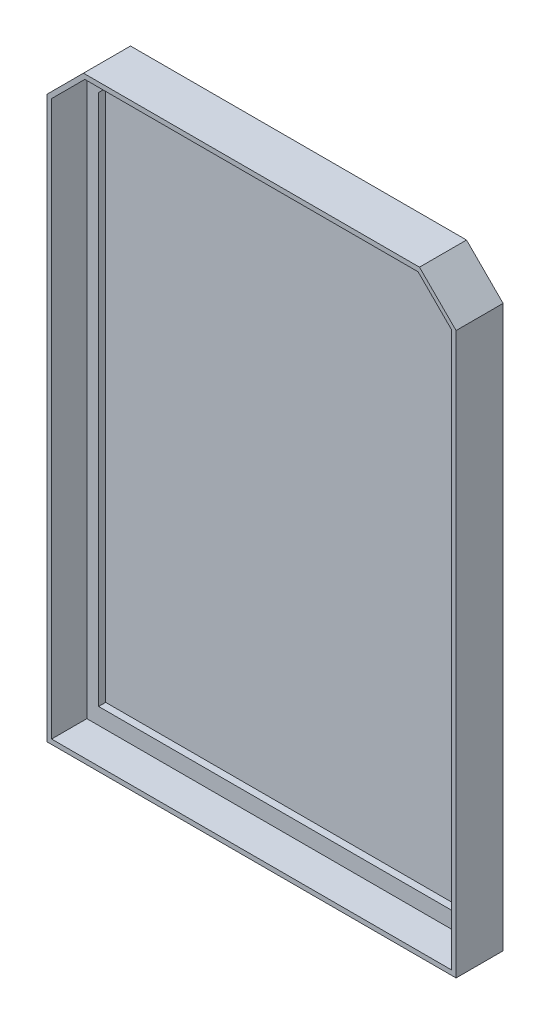
ISO-10303-21;
HEADER;
FILE_DESCRIPTION(('STEP AP214'),'2;1');
FILE_NAME('part.step','',(''),(''),'','','');
FILE_SCHEMA(('AUTOMOTIVE_DESIGN { 1 0 10303 214 1 1 1 1 }'));
ENDSEC;
DATA;
#1=APPLICATION_CONTEXT('core data for automotive mechanical design processes');
#2=APPLICATION_PROTOCOL_DEFINITION('international standard','automotive_design',2000,#1);
#3=PRODUCT_CONTEXT('',#1,'mechanical');
#4=PRODUCT('Part','Part','',(#3));
#5=PRODUCT_RELATED_PRODUCT_CATEGORY('part','',(#4));
#6=PRODUCT_DEFINITION_FORMATION('','',#4);
#7=PRODUCT_DEFINITION_CONTEXT('part definition',#1,'design');
#8=PRODUCT_DEFINITION('design','',#6,#7);
#9=PRODUCT_DEFINITION_SHAPE('','',#8);
#10=(LENGTH_UNIT() NAMED_UNIT(*) SI_UNIT(.MILLI.,.METRE.));
#11=(NAMED_UNIT(*) PLANE_ANGLE_UNIT() SI_UNIT($,.RADIAN.));
#12=(NAMED_UNIT(*) SI_UNIT($,.STERADIAN.) SOLID_ANGLE_UNIT());
#13=UNCERTAINTY_MEASURE_WITH_UNIT(LENGTH_MEASURE(1.E-05),#10,'distance_accuracy_value','');
#14=(GEOMETRIC_REPRESENTATION_CONTEXT(3) GLOBAL_UNCERTAINTY_ASSIGNED_CONTEXT((#13)) GLOBAL_UNIT_ASSIGNED_CONTEXT((#10,
#11,#12)) REPRESENTATION_CONTEXT('',''));
#15=CARTESIAN_POINT('',(0.,0.,0.));
#16=DIRECTION('',(0.,0.,1.));
#17=DIRECTION('',(1.,0.,0.));
#18=AXIS2_PLACEMENT_3D('',#15,#16,#17);
#19=CARTESIAN_POINT('',(47.0251262658472,47.0251262658468,1.5));
#20=DIRECTION('',(0.70710678118655,0.707106781186544,0.));
#21=DIRECTION('',(-0.707106781186545,0.707106781186551,0.));
#22=AXIS2_PLACEMENT_3D('',#19,#20,#21);
#23=PLANE('',#22);
#24=DIRECTION('',(0.707106781186545,-0.707106781186551,0.));
#25=VECTOR('',#24,1.);
#26=CARTESIAN_POINT('',(47.0251262658472,47.0251262658468,0.));
#27=LINE('',#26,#25);
#28=CARTESIAN_POINT('',(35.0502525316942,59.,0.));
#29=VERTEX_POINT('',#28);
#30=CARTESIAN_POINT('',(40.,54.0502525316941,0.));
#31=VERTEX_POINT('',#30);
#32=EDGE_CURVE('E171',#29,#31,#27,.T.);
#33=ORIENTED_EDGE('',*,*,#32,.T.);
#34=DIRECTION('',(0.,0.,-1.));
#35=VECTOR('',#34,1.);
#36=CARTESIAN_POINT('',(40.,54.0502525316941,1.5));
#37=LINE('',#36,#35);
#38=CARTESIAN_POINT('',(40.,54.0502525316941,1.5));
#39=VERTEX_POINT('',#38);
#40=EDGE_CURVE('E318',#39,#31,#37,.T.);
#41=ORIENTED_EDGE('',*,*,#40,.F.);
#42=DIRECTION('',(0.707106781186545,-0.707106781186551,0.));
#43=VECTOR('',#42,1.);
#44=CARTESIAN_POINT('',(47.0251262658472,47.0251262658468,1.5));
#45=LINE('',#44,#43);
#46=CARTESIAN_POINT('',(35.0502525316942,59.,1.5));
#47=VERTEX_POINT('',#46);
#48=EDGE_CURVE('E259',#47,#39,#45,.T.);
#49=ORIENTED_EDGE('',*,*,#48,.F.);
#50=DIRECTION('',(0.,0.,-1.));
#51=VECTOR('',#50,1.);
#52=CARTESIAN_POINT('',(35.0502525316942,59.,1.5));
#53=LINE('',#52,#51);
#54=EDGE_CURVE('E288',#47,#29,#53,.T.);
#55=ORIENTED_EDGE('',*,*,#54,.T.);
#56=EDGE_LOOP('',(#33,#41,#49,#55));
#57=FACE_BOUND('',#56,.T.);
#58=ADVANCED_FACE('F41',(#57),#23,.F.);
#59=CARTESIAN_POINT('',(40.,0.,1.5));
#60=DIRECTION('',(1.,0.,0.));
#61=DIRECTION('',(0.,0.,-1.));
#62=AXIS2_PLACEMENT_3D('',#59,#60,#61);
#63=PLANE('',#62);
#64=DIRECTION('',(0.,-1.,0.));
#65=VECTOR('',#64,1.);
#66=CARTESIAN_POINT('',(40.,0.,0.));
#67=LINE('',#66,#65);
#68=CARTESIAN_POINT('',(40.,-59.,0.));
#69=VERTEX_POINT('',#68);
#70=EDGE_CURVE('E291',#31,#69,#67,.T.);
#71=ORIENTED_EDGE('',*,*,#70,.T.);
#72=DIRECTION('',(0.,0.,-1.));
#73=VECTOR('',#72,1.);
#74=CARTESIAN_POINT('',(40.,-59.,1.5));
#75=LINE('',#74,#73);
#76=CARTESIAN_POINT('',(40.,-59.,1.5));
#77=VERTEX_POINT('',#76);
#78=EDGE_CURVE('E315',#77,#69,#75,.T.);
#79=ORIENTED_EDGE('',*,*,#78,.F.);
#80=DIRECTION('',(0.,-1.,0.));
#81=VECTOR('',#80,1.);
#82=CARTESIAN_POINT('',(40.,0.,1.5));
#83=LINE('',#82,#81);
#84=EDGE_CURVE('E262',#39,#77,#83,.T.);
#85=ORIENTED_EDGE('',*,*,#84,.F.);
#86=ORIENTED_EDGE('',*,*,#40,.T.);
#87=EDGE_LOOP('',(#71,#79,#85,#86));
#88=FACE_BOUND('',#87,.T.);
#89=ADVANCED_FACE('F338',(#88),#63,.F.);
#90=CARTESIAN_POINT('',(0.,-59.,1.5));
#91=DIRECTION('',(0.,-1.,0.));
#92=DIRECTION('',(0.,0.,-1.));
#93=AXIS2_PLACEMENT_3D('',#90,#91,#92);
#94=PLANE('',#93);
#95=DIRECTION('',(-1.,0.,0.));
#96=VECTOR('',#95,1.);
#97=CARTESIAN_POINT('',(0.,-59.,0.));
#98=LINE('',#97,#96);
#99=CARTESIAN_POINT('',(-40.,-59.,0.));
#100=VERTEX_POINT('',#99);
#101=EDGE_CURVE('E294',#69,#100,#98,.T.);
#102=ORIENTED_EDGE('',*,*,#101,.T.);
#103=DIRECTION('',(0.,0.,-1.));
#104=VECTOR('',#103,1.);
#105=CARTESIAN_POINT('',(-40.,-59.,1.5));
#106=LINE('',#105,#104);
#107=CARTESIAN_POINT('',(-40.,-59.,1.5));
#108=VERTEX_POINT('',#107);
#109=EDGE_CURVE('E312',#108,#100,#106,.T.);
#110=ORIENTED_EDGE('',*,*,#109,.F.);
#111=DIRECTION('',(-1.,0.,0.));
#112=VECTOR('',#111,1.);
#113=CARTESIAN_POINT('',(0.,-59.,1.5));
#114=LINE('',#113,#112);
#115=EDGE_CURVE('E265',#77,#108,#114,.T.);
#116=ORIENTED_EDGE('',*,*,#115,.F.);
#117=ORIENTED_EDGE('',*,*,#78,.T.);
#118=EDGE_LOOP('',(#102,#110,#116,#117));
#119=FACE_BOUND('',#118,.T.);
#120=ADVANCED_FACE('F344',(#119),#94,.F.);
#121=CARTESIAN_POINT('',(-40.,0.,1.5));
#122=DIRECTION('',(-1.,0.,0.));
#123=DIRECTION('',(0.,0.,1.));
#124=AXIS2_PLACEMENT_3D('',#121,#122,#123);
#125=PLANE('',#124);
#126=DIRECTION('',(0.,1.,0.));
#127=VECTOR('',#126,1.);
#128=CARTESIAN_POINT('',(-40.,0.,0.));
#129=LINE('',#128,#127);
#130=CARTESIAN_POINT('',(-40.,54.0502525316942,0.));
#131=VERTEX_POINT('',#130);
#132=EDGE_CURVE('E297',#100,#131,#129,.T.);
#133=ORIENTED_EDGE('',*,*,#132,.T.);
#134=DIRECTION('',(0.,0.,-1.));
#135=VECTOR('',#134,1.);
#136=CARTESIAN_POINT('',(-40.,54.0502525316942,1.5));
#137=LINE('',#136,#135);
#138=CARTESIAN_POINT('',(-40.,54.0502525316942,1.5));
#139=VERTEX_POINT('',#138);
#140=EDGE_CURVE('E309',#139,#131,#137,.T.);
#141=ORIENTED_EDGE('',*,*,#140,.F.);
#142=DIRECTION('',(0.,1.,0.));
#143=VECTOR('',#142,1.);
#144=CARTESIAN_POINT('',(-40.,0.,1.5));
#145=LINE('',#144,#143);
#146=EDGE_CURVE('E267',#108,#139,#145,.T.);
#147=ORIENTED_EDGE('',*,*,#146,.F.);
#148=ORIENTED_EDGE('',*,*,#109,.T.);
#149=EDGE_LOOP('',(#133,#141,#147,#148));
#150=FACE_BOUND('',#149,.T.);
#151=ADVANCED_FACE('F350',(#150),#125,.F.);
#152=CARTESIAN_POINT('',(-47.025126265847,47.0251262658472,1.5));
#153=DIRECTION('',(-0.707106781186545,0.707106781186549,0.));
#154=DIRECTION('',(-0.70710678118655,-0.707106781186546,0.));
#155=AXIS2_PLACEMENT_3D('',#152,#153,#154);
#156=PLANE('',#155);
#157=DIRECTION('',(0.70710678118655,0.707106781186546,0.));
#158=VECTOR('',#157,1.);
#159=CARTESIAN_POINT('',(-47.025126265847,47.0251262658472,0.));
#160=LINE('',#159,#158);
#161=CARTESIAN_POINT('',(-35.0502525316941,59.,0.));
#162=VERTEX_POINT('',#161);
#163=EDGE_CURVE('E300',#131,#162,#160,.T.);
#164=ORIENTED_EDGE('',*,*,#163,.T.);
#165=DIRECTION('',(0.,0.,-1.));
#166=VECTOR('',#165,1.);
#167=CARTESIAN_POINT('',(-35.0502525316941,59.,1.5));
#168=LINE('',#167,#166);
#169=CARTESIAN_POINT('',(-35.0502525316941,59.,1.5));
#170=VERTEX_POINT('',#169);
#171=EDGE_CURVE('E306',#170,#162,#168,.T.);
#172=ORIENTED_EDGE('',*,*,#171,.F.);
#173=DIRECTION('',(0.70710678118655,0.707106781186546,0.));
#174=VECTOR('',#173,1.);
#175=CARTESIAN_POINT('',(-47.025126265847,47.0251262658472,1.5));
#176=LINE('',#175,#174);
#177=EDGE_CURVE('E269',#139,#170,#176,.T.);
#178=ORIENTED_EDGE('',*,*,#177,.F.);
#179=ORIENTED_EDGE('',*,*,#140,.T.);
#180=EDGE_LOOP('',(#164,#172,#178,#179));
#181=FACE_BOUND('',#180,.T.);
#182=ADVANCED_FACE('F354',(#181),#156,.F.);
#183=CARTESIAN_POINT('',(0.,59.,1.5));
#184=DIRECTION('',(0.,-1.,0.));
#185=DIRECTION('',(1.,0.,0.));
#186=AXIS2_PLACEMENT_3D('',#183,#184,#185);
#187=PLANE('',#186);
#188=DIRECTION('',(-1.,0.,0.));
#189=VECTOR('',#188,1.);
#190=CARTESIAN_POINT('',(0.,59.,0.));
#191=LINE('',#190,#189);
#192=EDGE_CURVE('E263',#29,#162,#191,.T.);
#193=ORIENTED_EDGE('',*,*,#192,.F.);
#194=ORIENTED_EDGE('',*,*,#54,.F.);
#195=DIRECTION('',(-1.,0.,0.));
#196=VECTOR('',#195,1.);
#197=CARTESIAN_POINT('',(0.,59.,1.5));
#198=LINE('',#197,#196);
#199=EDGE_CURVE('E271',#47,#170,#198,.T.);
#200=ORIENTED_EDGE('',*,*,#199,.T.);
#201=ORIENTED_EDGE('',*,*,#171,.T.);
#202=EDGE_LOOP('',(#193,#194,#200,#201));
#203=FACE_BOUND('',#202,.T.);
#204=ADVANCED_FACE('F358',(#203),#187,.T.);
#205=CARTESIAN_POINT('',(0.,0.,1.5));
#206=DIRECTION('',(0.,0.,1.));
#207=DIRECTION('',(1.,0.,0.));
#208=AXIS2_PLACEMENT_3D('',#205,#206,#207);
#209=PLANE('',#208);
#210=ORIENTED_EDGE('',*,*,#48,.T.);
#211=ORIENTED_EDGE('',*,*,#84,.T.);
#212=ORIENTED_EDGE('',*,*,#115,.T.);
#213=ORIENTED_EDGE('',*,*,#146,.T.);
#214=ORIENTED_EDGE('',*,*,#177,.T.);
#215=ORIENTED_EDGE('',*,*,#199,.F.);
#216=EDGE_LOOP('',(#210,#211,#212,#213,#214,#215));
#217=FACE_BOUND('',#216,.T.);
#218=DIRECTION('',(0.707106781186548,0.707106781186547,0.));
#219=VECTOR('',#218,1.);
#220=CARTESIAN_POINT('',(-48.9644660940672,48.9644660940673,1.5));
#221=LINE('',#220,#219);
#222=CARTESIAN_POINT('',(-42.5,55.4289321881345,1.5));
#223=VERTEX_POINT('',#222);
#224=CARTESIAN_POINT('',(-35.4289321881345,62.5,1.5));
#225=VERTEX_POINT('',#224);
#226=EDGE_CURVE('E274',#223,#225,#221,.T.);
#227=ORIENTED_EDGE('',*,*,#226,.F.);
#228=DIRECTION('',(0.,-1.,0.));
#229=VECTOR('',#228,1.);
#230=CARTESIAN_POINT('',(-42.5,0.,1.5));
#231=LINE('',#230,#229);
#232=CARTESIAN_POINT('',(-42.5,-62.5,1.5));
#233=VERTEX_POINT('',#232);
#234=EDGE_CURVE('E276',#223,#233,#231,.T.);
#235=ORIENTED_EDGE('',*,*,#234,.T.);
#236=DIRECTION('',(-1.,0.,0.));
#237=VECTOR('',#236,1.);
#238=CARTESIAN_POINT('',(0.,-62.5,1.5));
#239=LINE('',#238,#237);
#240=CARTESIAN_POINT('',(42.5,-62.5,1.5));
#241=VERTEX_POINT('',#240);
#242=EDGE_CURVE('E278',#241,#233,#239,.T.);
#243=ORIENTED_EDGE('',*,*,#242,.F.);
#244=DIRECTION('',(0.,-1.,0.));
#245=VECTOR('',#244,1.);
#246=CARTESIAN_POINT('',(42.5,0.,1.5));
#247=LINE('',#246,#245);
#248=CARTESIAN_POINT('',(42.5,55.4289321881345,1.5));
#249=VERTEX_POINT('',#248);
#250=EDGE_CURVE('E281',#249,#241,#247,.T.);
#251=ORIENTED_EDGE('',*,*,#250,.F.);
#252=DIRECTION('',(0.707106781186546,-0.70710678118655,0.));
#253=VECTOR('',#252,1.);
#254=CARTESIAN_POINT('',(48.9644660940674,48.9644660940671,1.5));
#255=LINE('',#254,#253);
#256=CARTESIAN_POINT('',(35.4289321881346,62.5,1.5));
#257=VERTEX_POINT('',#256);
#258=EDGE_CURVE('E284',#257,#249,#255,.T.);
#259=ORIENTED_EDGE('',*,*,#258,.F.);
#260=DIRECTION('',(-1.,0.,0.));
#261=VECTOR('',#260,1.);
#262=CARTESIAN_POINT('',(0.,62.5,1.5));
#263=LINE('',#262,#261);
#264=EDGE_CURVE('E57',#257,#225,#263,.T.);
#265=ORIENTED_EDGE('',*,*,#264,.T.);
#266=EDGE_LOOP('',(#227,#235,#243,#251,#259,#265));
#267=FACE_BOUND('',#266,.T.);
#268=ADVANCED_FACE('F362',(#217,#267),#209,.T.);
#269=CARTESIAN_POINT('',(0.,-63.5,9.));
#270=DIRECTION('',(0.,1.,0.));
#271=DIRECTION('',(0.,0.,1.));
#272=AXIS2_PLACEMENT_3D('',#269,#270,#271);
#273=PLANE('',#272);
#274=DIRECTION('',(0.,0.,-1.));
#275=VECTOR('',#274,1.);
#276=CARTESIAN_POINT('',(-43.5,-63.5,9.));
#277=LINE('',#276,#275);
#278=CARTESIAN_POINT('',(-43.5,-63.5,9.));
#279=VERTEX_POINT('',#278);
#280=CARTESIAN_POINT('',(-43.5,-63.5,-1.));
#281=VERTEX_POINT('',#280);
#282=EDGE_CURVE('E187',#279,#281,#277,.T.);
#283=ORIENTED_EDGE('',*,*,#282,.T.);
#284=DIRECTION('',(1.,0.,0.));
#285=VECTOR('',#284,1.);
#286=CARTESIAN_POINT('',(0.,-63.5,-1.));
#287=LINE('',#286,#285);
#288=CARTESIAN_POINT('',(43.5,-63.5,-1.));
#289=VERTEX_POINT('',#288);
#290=EDGE_CURVE('E179',#281,#289,#287,.T.);
#291=ORIENTED_EDGE('',*,*,#290,.T.);
#292=DIRECTION('',(0.,0.,-1.));
#293=VECTOR('',#292,1.);
#294=CARTESIAN_POINT('',(43.5,-63.5,9.));
#295=LINE('',#294,#293);
#296=CARTESIAN_POINT('',(43.5,-63.5,9.));
#297=VERTEX_POINT('',#296);
#298=EDGE_CURVE('E161',#297,#289,#295,.T.);
#299=ORIENTED_EDGE('',*,*,#298,.F.);
#300=DIRECTION('',(1.,0.,0.));
#301=VECTOR('',#300,1.);
#302=CARTESIAN_POINT('',(0.,-63.5,9.));
#303=LINE('',#302,#301);
#304=EDGE_CURVE('E222',#279,#297,#303,.T.);
#305=ORIENTED_EDGE('',*,*,#304,.F.);
#306=EDGE_LOOP('',(#283,#291,#299,#305));
#307=FACE_BOUND('',#306,.T.);
#308=ADVANCED_FACE('F185',(#307),#273,.F.);
#309=CARTESIAN_POINT('',(43.5,0.,9.));
#310=DIRECTION('',(-1.,0.,0.));
#311=DIRECTION('',(0.,0.,1.));
#312=AXIS2_PLACEMENT_3D('',#309,#310,#311);
#313=PLANE('',#312);
#314=ORIENTED_EDGE('',*,*,#298,.T.);
#315=DIRECTION('',(0.,1.,0.));
#316=VECTOR('',#315,1.);
#317=CARTESIAN_POINT('',(43.5,0.,-1.));
#318=LINE('',#317,#316);
#319=CARTESIAN_POINT('',(43.5,55.721825406948,-1.));
#320=VERTEX_POINT('',#319);
#321=EDGE_CURVE('E165',#289,#320,#318,.T.);
#322=ORIENTED_EDGE('',*,*,#321,.T.);
#323=DIRECTION('',(0.,0.,-1.));
#324=VECTOR('',#323,1.);
#325=CARTESIAN_POINT('',(43.5,55.721825406948,9.));
#326=LINE('',#325,#324);
#327=CARTESIAN_POINT('',(43.5,55.721825406948,9.));
#328=VERTEX_POINT('',#327);
#329=EDGE_CURVE('E172',#328,#320,#326,.T.);
#330=ORIENTED_EDGE('',*,*,#329,.F.);
#331=DIRECTION('',(0.,1.,0.));
#332=VECTOR('',#331,1.);
#333=CARTESIAN_POINT('',(43.5,0.,9.));
#334=LINE('',#333,#332);
#335=EDGE_CURVE('E166',#297,#328,#334,.T.);
#336=ORIENTED_EDGE('',*,*,#335,.F.);
#337=EDGE_LOOP('',(#314,#322,#330,#336));
#338=FACE_BOUND('',#337,.T.);
#339=ADVANCED_FACE('F163',(#338),#313,.F.);
#340=CARTESIAN_POINT('',(49.610912703474,49.610912703474,9.));
#341=DIRECTION('',(-0.707106781186547,-0.707106781186547,0.));
#342=DIRECTION('',(0.707106781186548,-0.707106781186548,0.));
#343=AXIS2_PLACEMENT_3D('',#340,#341,#342);
#344=PLANE('',#343);
#345=ORIENTED_EDGE('',*,*,#329,.T.);
#346=DIRECTION('',(-0.707106781186548,0.707106781186548,0.));
#347=VECTOR('',#346,1.);
#348=CARTESIAN_POINT('',(49.610912703474,49.610912703474,-1.));
#349=LINE('',#348,#347);
#350=CARTESIAN_POINT('',(35.721825406948,63.5,-1.));
#351=VERTEX_POINT('',#350);
#352=EDGE_CURVE('E183',#320,#351,#349,.T.);
#353=ORIENTED_EDGE('',*,*,#352,.T.);
#354=DIRECTION('',(0.,0.,-1.));
#355=VECTOR('',#354,1.);
#356=CARTESIAN_POINT('',(35.721825406948,63.5,9.));
#357=LINE('',#356,#355);
#358=CARTESIAN_POINT('',(35.721825406948,63.5,9.));
#359=VERTEX_POINT('',#358);
#360=EDGE_CURVE('E240',#359,#351,#357,.T.);
#361=ORIENTED_EDGE('',*,*,#360,.F.);
#362=DIRECTION('',(-0.707106781186548,0.707106781186548,0.));
#363=VECTOR('',#362,1.);
#364=CARTESIAN_POINT('',(49.610912703474,49.610912703474,9.));
#365=LINE('',#364,#363);
#366=EDGE_CURVE('E225',#328,#359,#365,.T.);
#367=ORIENTED_EDGE('',*,*,#366,.F.);
#368=EDGE_LOOP('',(#345,#353,#361,#367));
#369=FACE_BOUND('',#368,.T.);
#370=ADVANCED_FACE('F397',(#369),#344,.F.);
#371=CARTESIAN_POINT('',(0.,63.5,9.));
#372=DIRECTION('',(0.,-1.,0.));
#373=DIRECTION('',(0.,0.,-1.));
#374=AXIS2_PLACEMENT_3D('',#371,#372,#373);
#375=PLANE('',#374);
#376=ORIENTED_EDGE('',*,*,#360,.T.);
#377=DIRECTION('',(-1.,0.,0.));
#378=VECTOR('',#377,1.);
#379=CARTESIAN_POINT('',(0.,63.5,-1.));
#380=LINE('',#379,#378);
#381=CARTESIAN_POINT('',(-35.721825406948,63.5,-1.));
#382=VERTEX_POINT('',#381);
#383=EDGE_CURVE('E196',#351,#382,#380,.T.);
#384=ORIENTED_EDGE('',*,*,#383,.T.);
#385=DIRECTION('',(0.,0.,-1.));
#386=VECTOR('',#385,1.);
#387=CARTESIAN_POINT('',(-35.721825406948,63.5,9.));
#388=LINE('',#387,#386);
#389=CARTESIAN_POINT('',(-35.721825406948,63.5,9.));
#390=VERTEX_POINT('',#389);
#391=EDGE_CURVE('E238',#390,#382,#388,.T.);
#392=ORIENTED_EDGE('',*,*,#391,.F.);
#393=DIRECTION('',(-1.,0.,0.));
#394=VECTOR('',#393,1.);
#395=CARTESIAN_POINT('',(0.,63.5,9.));
#396=LINE('',#395,#394);
#397=EDGE_CURVE('E227',#359,#390,#396,.T.);
#398=ORIENTED_EDGE('',*,*,#397,.F.);
#399=EDGE_LOOP('',(#376,#384,#392,#398));
#400=FACE_BOUND('',#399,.T.);
#401=ADVANCED_FACE('F400',(#400),#375,.F.);
#402=CARTESIAN_POINT('',(-49.6109127034739,49.6109127034742,9.));
#403=DIRECTION('',(0.707106781186545,-0.70710678118655,0.));
#404=DIRECTION('',(0.70710678118655,0.707106781186545,0.));
#405=AXIS2_PLACEMENT_3D('',#402,#403,#404);
#406=PLANE('',#405);
#407=ORIENTED_EDGE('',*,*,#391,.T.);
#408=DIRECTION('',(-0.70710678118655,-0.707106781186545,0.));
#409=VECTOR('',#408,1.);
#410=CARTESIAN_POINT('',(-49.6109127034739,49.6109127034742,-1.));
#411=LINE('',#410,#409);
#412=CARTESIAN_POINT('',(-43.5,55.721825406948,-1.));
#413=VERTEX_POINT('',#412);
#414=EDGE_CURVE('E199',#382,#413,#411,.T.);
#415=ORIENTED_EDGE('',*,*,#414,.T.);
#416=DIRECTION('',(0.,0.,-1.));
#417=VECTOR('',#416,1.);
#418=CARTESIAN_POINT('',(-43.5,55.721825406948,9.));
#419=LINE('',#418,#417);
#420=CARTESIAN_POINT('',(-43.5,55.721825406948,9.));
#421=VERTEX_POINT('',#420);
#422=EDGE_CURVE('E235',#421,#413,#419,.T.);
#423=ORIENTED_EDGE('',*,*,#422,.F.);
#424=DIRECTION('',(-0.70710678118655,-0.707106781186545,0.));
#425=VECTOR('',#424,1.);
#426=CARTESIAN_POINT('',(-49.6109127034739,49.6109127034742,9.));
#427=LINE('',#426,#425);
#428=EDGE_CURVE('E229',#390,#421,#427,.T.);
#429=ORIENTED_EDGE('',*,*,#428,.F.);
#430=EDGE_LOOP('',(#407,#415,#423,#429));
#431=FACE_BOUND('',#430,.T.);
#432=ADVANCED_FACE('F371',(#431),#406,.F.);
#433=CARTESIAN_POINT('',(42.5,0.,9.));
#434=DIRECTION('',(-1.,0.,0.));
#435=DIRECTION('',(0.,0.,1.));
#436=AXIS2_PLACEMENT_3D('',#433,#434,#435);
#437=PLANE('',#436);
#438=DIRECTION('',(0.,0.,-1.));
#439=VECTOR('',#438,1.);
#440=CARTESIAN_POINT('',(42.5,55.4289321881345,9.));
#441=LINE('',#440,#439);
#442=CARTESIAN_POINT('',(42.5,55.4289321881345,9.));
#443=VERTEX_POINT('',#442);
#444=EDGE_CURVE('E233',#443,#249,#441,.T.);
#445=ORIENTED_EDGE('',*,*,#444,.T.);
#446=ORIENTED_EDGE('',*,*,#250,.T.);
#447=DIRECTION('',(0.,0.,-1.));
#448=VECTOR('',#447,1.);
#449=CARTESIAN_POINT('',(42.5,-62.5,9.));
#450=LINE('',#449,#448);
#451=CARTESIAN_POINT('',(42.5,-62.5,9.));
#452=VERTEX_POINT('',#451);
#453=EDGE_CURVE('E236',#452,#241,#450,.T.);
#454=ORIENTED_EDGE('',*,*,#453,.F.);
#455=DIRECTION('',(0.,1.,0.));
#456=VECTOR('',#455,1.);
#457=CARTESIAN_POINT('',(42.5,0.,9.));
#458=LINE('',#457,#456);
#459=EDGE_CURVE('E204',#452,#443,#458,.T.);
#460=ORIENTED_EDGE('',*,*,#459,.T.);
#461=EDGE_LOOP('',(#445,#446,#454,#460));
#462=FACE_BOUND('',#461,.T.);
#463=ADVANCED_FACE('F367',(#462),#437,.T.);
#464=CARTESIAN_POINT('',(0.,-62.5,9.));
#465=DIRECTION('',(0.,1.,0.));
#466=DIRECTION('',(0.,0.,1.));
#467=AXIS2_PLACEMENT_3D('',#464,#465,#466);
#468=PLANE('',#467);
#469=ORIENTED_EDGE('',*,*,#453,.T.);
#470=ORIENTED_EDGE('',*,*,#242,.T.);
#471=DIRECTION('',(0.,0.,-1.));
#472=VECTOR('',#471,1.);
#473=CARTESIAN_POINT('',(-42.5,-62.5,9.));
#474=LINE('',#473,#472);
#475=CARTESIAN_POINT('',(-42.5,-62.5,9.));
#476=VERTEX_POINT('',#475);
#477=EDGE_CURVE('E254',#476,#233,#474,.T.);
#478=ORIENTED_EDGE('',*,*,#477,.F.);
#479=DIRECTION('',(1.,0.,0.));
#480=VECTOR('',#479,1.);
#481=CARTESIAN_POINT('',(0.,-62.5,9.));
#482=LINE('',#481,#480);
#483=EDGE_CURVE('E207',#476,#452,#482,.T.);
#484=ORIENTED_EDGE('',*,*,#483,.T.);
#485=EDGE_LOOP('',(#469,#470,#478,#484));
#486=FACE_BOUND('',#485,.T.);
#487=ADVANCED_FACE('F370',(#486),#468,.T.);
#488=CARTESIAN_POINT('',(-42.5,0.,9.));
#489=DIRECTION('',(1.,0.,0.));
#490=DIRECTION('',(0.,0.,-1.));
#491=AXIS2_PLACEMENT_3D('',#488,#489,#490);
#492=PLANE('',#491);
#493=ORIENTED_EDGE('',*,*,#477,.T.);
#494=ORIENTED_EDGE('',*,*,#234,.F.);
#495=DIRECTION('',(0.,0.,-1.));
#496=VECTOR('',#495,1.);
#497=CARTESIAN_POINT('',(-42.5,55.4289321881345,9.));
#498=LINE('',#497,#496);
#499=CARTESIAN_POINT('',(-42.5,55.4289321881345,9.));
#500=VERTEX_POINT('',#499);
#501=EDGE_CURVE('E251',#500,#223,#498,.T.);
#502=ORIENTED_EDGE('',*,*,#501,.F.);
#503=DIRECTION('',(0.,-1.,0.));
#504=VECTOR('',#503,1.);
#505=CARTESIAN_POINT('',(-42.5,0.,9.));
#506=LINE('',#505,#504);
#507=EDGE_CURVE('E210',#500,#476,#506,.T.);
#508=ORIENTED_EDGE('',*,*,#507,.T.);
#509=EDGE_LOOP('',(#493,#494,#502,#508));
#510=FACE_BOUND('',#509,.T.);
#511=ADVANCED_FACE('F375',(#510),#492,.T.);
#512=CARTESIAN_POINT('',(-48.9644660940672,48.9644660940673,9.));
#513=DIRECTION('',(0.707106781186547,-0.707106781186548,0.));
#514=DIRECTION('',(0.707106781186548,0.707106781186547,0.));
#515=AXIS2_PLACEMENT_3D('',#512,#513,#514);
#516=PLANE('',#515);
#517=ORIENTED_EDGE('',*,*,#501,.T.);
#518=ORIENTED_EDGE('',*,*,#226,.T.);
#519=DIRECTION('',(0.,0.,-1.));
#520=VECTOR('',#519,1.);
#521=CARTESIAN_POINT('',(-35.4289321881345,62.5,9.));
#522=LINE('',#521,#520);
#523=CARTESIAN_POINT('',(-35.4289321881345,62.5,9.));
#524=VERTEX_POINT('',#523);
#525=EDGE_CURVE('E248',#524,#225,#522,.T.);
#526=ORIENTED_EDGE('',*,*,#525,.F.);
#527=DIRECTION('',(-0.707106781186548,-0.707106781186547,0.));
#528=VECTOR('',#527,1.);
#529=CARTESIAN_POINT('',(-48.9644660940672,48.9644660940673,9.));
#530=LINE('',#529,#528);
#531=EDGE_CURVE('E213',#524,#500,#530,.T.);
#532=ORIENTED_EDGE('',*,*,#531,.T.);
#533=EDGE_LOOP('',(#517,#518,#526,#532));
#534=FACE_BOUND('',#533,.T.);
#535=ADVANCED_FACE('F379',(#534),#516,.T.);
#536=CARTESIAN_POINT('',(0.,62.5,9.));
#537=DIRECTION('',(0.,-1.,0.));
#538=DIRECTION('',(0.,0.,-1.));
#539=AXIS2_PLACEMENT_3D('',#536,#537,#538);
#540=PLANE('',#539);
#541=ORIENTED_EDGE('',*,*,#525,.T.);
#542=ORIENTED_EDGE('',*,*,#264,.F.);
#543=DIRECTION('',(0.,0.,-1.));
#544=VECTOR('',#543,1.);
#545=CARTESIAN_POINT('',(35.4289321881346,62.5,9.));
#546=LINE('',#545,#544);
#547=CARTESIAN_POINT('',(35.4289321881346,62.5,9.));
#548=VERTEX_POINT('',#547);
#549=EDGE_CURVE('E245',#548,#257,#546,.T.);
#550=ORIENTED_EDGE('',*,*,#549,.F.);
#551=DIRECTION('',(-1.,0.,0.));
#552=VECTOR('',#551,1.);
#553=CARTESIAN_POINT('',(0.,62.5,9.));
#554=LINE('',#553,#552);
#555=EDGE_CURVE('E216',#548,#524,#554,.T.);
#556=ORIENTED_EDGE('',*,*,#555,.T.);
#557=EDGE_LOOP('',(#541,#542,#550,#556));
#558=FACE_BOUND('',#557,.T.);
#559=ADVANCED_FACE('F383',(#558),#540,.T.);
#560=CARTESIAN_POINT('',(48.9644660940674,48.9644660940671,9.));
#561=DIRECTION('',(-0.707106781186549,-0.707106781186545,0.));
#562=DIRECTION('',(0.707106781186546,-0.70710678118655,0.));
#563=AXIS2_PLACEMENT_3D('',#560,#561,#562);
#564=PLANE('',#563);
#565=ORIENTED_EDGE('',*,*,#549,.T.);
#566=ORIENTED_EDGE('',*,*,#258,.T.);
#567=ORIENTED_EDGE('',*,*,#444,.F.);
#568=DIRECTION('',(-0.707106781186546,0.70710678118655,0.));
#569=VECTOR('',#568,1.);
#570=CARTESIAN_POINT('',(48.9644660940674,48.9644660940671,9.));
#571=LINE('',#570,#569);
#572=EDGE_CURVE('E219',#443,#548,#571,.T.);
#573=ORIENTED_EDGE('',*,*,#572,.T.);
#574=EDGE_LOOP('',(#565,#566,#567,#573));
#575=FACE_BOUND('',#574,.T.);
#576=ADVANCED_FACE('F387',(#575),#564,.T.);
#577=CARTESIAN_POINT('',(-43.5,0.,9.));
#578=DIRECTION('',(1.,0.,0.));
#579=DIRECTION('',(0.,0.,-1.));
#580=AXIS2_PLACEMENT_3D('',#577,#578,#579);
#581=PLANE('',#580);
#582=ORIENTED_EDGE('',*,*,#422,.T.);
#583=DIRECTION('',(0.,-1.,0.));
#584=VECTOR('',#583,1.);
#585=CARTESIAN_POINT('',(-43.5,0.,-1.));
#586=LINE('',#585,#584);
#587=EDGE_CURVE('E202',#413,#281,#586,.T.);
#588=ORIENTED_EDGE('',*,*,#587,.T.);
#589=ORIENTED_EDGE('',*,*,#282,.F.);
#590=DIRECTION('',(0.,-1.,0.));
#591=VECTOR('',#590,1.);
#592=CARTESIAN_POINT('',(-43.5,0.,9.));
#593=LINE('',#592,#591);
#594=EDGE_CURVE('E231',#421,#279,#593,.T.);
#595=ORIENTED_EDGE('',*,*,#594,.F.);
#596=EDGE_LOOP('',(#582,#588,#589,#595));
#597=FACE_BOUND('',#596,.T.);
#598=ADVANCED_FACE('F391',(#597),#581,.F.);
#599=CARTESIAN_POINT('',(0.,0.,9.));
#600=DIRECTION('',(0.,0.,1.));
#601=DIRECTION('',(1.,0.,0.));
#602=AXIS2_PLACEMENT_3D('',#599,#600,#601);
#603=PLANE('',#602);
#604=ORIENTED_EDGE('',*,*,#459,.F.);
#605=ORIENTED_EDGE('',*,*,#483,.F.);
#606=ORIENTED_EDGE('',*,*,#507,.F.);
#607=ORIENTED_EDGE('',*,*,#531,.F.);
#608=ORIENTED_EDGE('',*,*,#555,.F.);
#609=ORIENTED_EDGE('',*,*,#572,.F.);
#610=EDGE_LOOP('',(#604,#605,#606,#607,#608,#609));
#611=FACE_BOUND('',#610,.T.);
#612=ORIENTED_EDGE('',*,*,#304,.T.);
#613=ORIENTED_EDGE('',*,*,#335,.T.);
#614=ORIENTED_EDGE('',*,*,#366,.T.);
#615=ORIENTED_EDGE('',*,*,#397,.T.);
#616=ORIENTED_EDGE('',*,*,#428,.T.);
#617=ORIENTED_EDGE('',*,*,#594,.T.);
#618=EDGE_LOOP('',(#612,#613,#614,#615,#616,#617));
#619=FACE_BOUND('',#618,.T.);
#620=ADVANCED_FACE('F410',(#611,#619),#603,.T.);
#621=CARTESIAN_POINT('',(0.,0.,0.));
#622=DIRECTION('',(0.,0.,1.));
#623=DIRECTION('',(1.,0.,0.));
#624=AXIS2_PLACEMENT_3D('',#621,#622,#623);
#625=PLANE('',#624);
#626=ORIENTED_EDGE('',*,*,#32,.F.);
#627=ORIENTED_EDGE('',*,*,#192,.T.);
#628=ORIENTED_EDGE('',*,*,#163,.F.);
#629=ORIENTED_EDGE('',*,*,#132,.F.);
#630=ORIENTED_EDGE('',*,*,#101,.F.);
#631=ORIENTED_EDGE('',*,*,#70,.F.);
#632=EDGE_LOOP('',(#626,#627,#628,#629,#630,#631));
#633=FACE_BOUND('',#632,.T.);
#634=ADVANCED_FACE('F413',(#633),#625,.T.);
#635=CARTESIAN_POINT('',(0.,0.,-1.));
#636=DIRECTION('',(0.,0.,1.));
#637=DIRECTION('',(1.,0.,0.));
#638=AXIS2_PLACEMENT_3D('',#635,#636,#637);
#639=PLANE('',#638);
#640=CARTESIAN_POINT('',(0.,0.,-1.));
#641=DIRECTION('',(0.,0.,1.));
#642=DIRECTION('',(1.,0.,0.));
#643=AXIS2_PLACEMENT_3D('',#640,#641,#642);
#644=CIRCLE('',#643,10.);
#645=CARTESIAN_POINT('',(10.,0.,-1.));
#646=VERTEX_POINT('',#645);
#647=EDGE_CURVE('E11',#646,#646,#644,.T.);
#648=ORIENTED_EDGE('',*,*,#647,.T.);
#649=EDGE_LOOP('',(#648));
#650=FACE_BOUND('',#649,.T.);
#651=ORIENTED_EDGE('',*,*,#290,.F.);
#652=ORIENTED_EDGE('',*,*,#587,.F.);
#653=ORIENTED_EDGE('',*,*,#414,.F.);
#654=ORIENTED_EDGE('',*,*,#383,.F.);
#655=ORIENTED_EDGE('',*,*,#352,.F.);
#656=ORIENTED_EDGE('',*,*,#321,.F.);
#657=EDGE_LOOP('',(#651,#652,#653,#654,#655,#656));
#658=FACE_BOUND('',#657,.T.);
#659=ADVANCED_FACE('F177',(#650,#658),#639,.F.);
#660=CARTESIAN_POINT('',(0.,0.,-11.));
#661=DIRECTION('',(0.,0.,-1.));
#662=DIRECTION('',(-1.,0.,0.));
#663=AXIS2_PLACEMENT_3D('',#660,#661,#662);
#664=PLANE('',#663);
#665=CARTESIAN_POINT('',(0.,0.,-11.));
#666=DIRECTION('',(0.,0.,-1.));
#667=DIRECTION('',(-1.,0.,0.));
#668=AXIS2_PLACEMENT_3D('',#665,#666,#667);
#669=CIRCLE('',#668,5.);
#670=CARTESIAN_POINT('',(-5.,0.,-11.));
#671=VERTEX_POINT('',#670);
#672=EDGE_CURVE('E188',#671,#671,#669,.T.);
#673=ORIENTED_EDGE('',*,*,#672,.T.);
#674=EDGE_LOOP('',(#673));
#675=FACE_BOUND('',#674,.T.);
#676=CARTESIAN_POINT('',(0.,0.,-11.));
#677=DIRECTION('',(0.,0.,-1.));
#678=DIRECTION('',(-1.,0.,0.));
#679=AXIS2_PLACEMENT_3D('',#676,#677,#678);
#680=CIRCLE('',#679,4.);
#681=CARTESIAN_POINT('',(-4.,0.,-11.));
#682=VERTEX_POINT('',#681);
#683=EDGE_CURVE('E191',#682,#682,#680,.T.);
#684=ORIENTED_EDGE('',*,*,#683,.F.);
#685=EDGE_LOOP('',(#684));
#686=FACE_BOUND('',#685,.T.);
#687=ADVANCED_FACE('F419',(#675,#686),#664,.T.);
#688=CARTESIAN_POINT('',(0.,0.,-11.));
#689=DIRECTION('',(0.,0.,1.));
#690=DIRECTION('',(1.,0.,0.));
#691=AXIS2_PLACEMENT_3D('',#688,#689,#690);
#692=CYLINDRICAL_SURFACE('',#691,5.);
#693=CARTESIAN_POINT('',(0.,0.,-6.));
#694=DIRECTION('',(0.,0.,1.));
#695=DIRECTION('',(1.,0.,0.));
#696=AXIS2_PLACEMENT_3D('',#693,#694,#695);
#697=CIRCLE('',#696,5.);
#698=CARTESIAN_POINT('',(5.,0.,-6.));
#699=VERTEX_POINT('',#698);
#700=EDGE_CURVE('E50',#699,#699,#697,.F.);
#701=ORIENTED_EDGE('',*,*,#700,.T.);
#702=EDGE_LOOP('',(#701));
#703=FACE_BOUND('',#702,.T.);
#704=ORIENTED_EDGE('',*,*,#672,.F.);
#705=EDGE_LOOP('',(#704));
#706=FACE_BOUND('',#705,.T.);
#707=ADVANCED_FACE('F323',(#703,#706),#692,.T.);
#708=CARTESIAN_POINT('',(0.,0.,-11.));
#709=DIRECTION('',(0.,0.,1.));
#710=DIRECTION('',(1.,0.,0.));
#711=AXIS2_PLACEMENT_3D('',#708,#709,#710);
#712=CYLINDRICAL_SURFACE('',#711,4.);
#713=ORIENTED_EDGE('',*,*,#683,.T.);
#714=EDGE_LOOP('',(#713));
#715=FACE_BOUND('',#714,.T.);
#716=CARTESIAN_POINT('',(0.,0.,-1.));
#717=DIRECTION('',(0.,0.,-1.));
#718=DIRECTION('',(-1.,0.,0.));
#719=AXIS2_PLACEMENT_3D('',#716,#717,#718);
#720=CIRCLE('',#719,4.);
#721=CARTESIAN_POINT('',(-4.,0.,-1.));
#722=VERTEX_POINT('',#721);
#723=EDGE_CURVE('E434',#722,#722,#720,.T.);
#724=ORIENTED_EDGE('',*,*,#723,.F.);
#725=EDGE_LOOP('',(#724));
#726=FACE_BOUND('',#725,.T.);
#727=ADVANCED_FACE('F333',(#715,#726),#712,.F.);
#728=ORIENTED_EDGE('',*,*,#723,.T.);
#729=EDGE_LOOP('',(#728));
#730=FACE_BOUND('',#729,.T.);
#731=ADVANCED_FACE('F327',(#730),#639,.F.);
#732=CARTESIAN_POINT('',(0.,0.,-6.));
#733=DIRECTION('',(0.,0.,1.));
#734=DIRECTION('',(1.,0.,0.));
#735=AXIS2_PLACEMENT_3D('',#732,#733,#734);
#736=TOROIDAL_SURFACE('',#735,10.,5.);
#737=ORIENTED_EDGE('',*,*,#647,.F.);
#738=EDGE_LOOP('',(#737));
#739=FACE_BOUND('',#738,.T.);
#740=ORIENTED_EDGE('',*,*,#700,.F.);
#741=EDGE_LOOP('',(#740));
#742=FACE_BOUND('',#741,.T.);
#743=ADVANCED_FACE('F43',(#739,#742),#736,.F.);
#744=CLOSED_SHELL('',(#58,#89,#120,#151,#182,#204,#268,#308,#339,#370,#401,#432,#463,#487,#511,
#535,#559,#576,#598,#620,#634,#659,#687,#707,#727,#731,#743));
#745=MANIFOLD_SOLID_BREP('B2',#744);
#746=ADVANCED_BREP_SHAPE_REPRESENTATION('',(#18,#745),#14);
#747=SHAPE_DEFINITION_REPRESENTATION(#9,#746);
ENDSEC;
END-ISO-10303-21;
